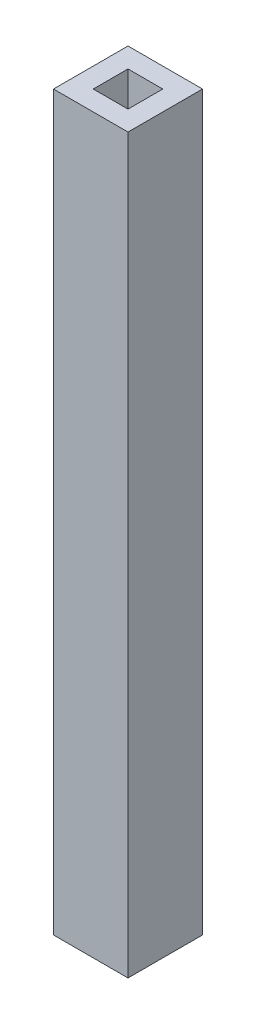
ISO-10303-21;
HEADER;
FILE_DESCRIPTION(('STEP AP214'),'2;1');
FILE_NAME('part.step','',(''),(''),'','','');
FILE_SCHEMA(('AUTOMOTIVE_DESIGN { 1 0 10303 214 1 1 1 1 }'));
ENDSEC;
DATA;
#1=APPLICATION_CONTEXT('core data for automotive mechanical design processes');
#2=APPLICATION_PROTOCOL_DEFINITION('international standard','automotive_design',2000,#1);
#3=PRODUCT_CONTEXT('',#1,'mechanical');
#4=PRODUCT('Part','Part','',(#3));
#5=PRODUCT_RELATED_PRODUCT_CATEGORY('part','',(#4));
#6=PRODUCT_DEFINITION_FORMATION('','',#4);
#7=PRODUCT_DEFINITION_CONTEXT('part definition',#1,'design');
#8=PRODUCT_DEFINITION('design','',#6,#7);
#9=PRODUCT_DEFINITION_SHAPE('','',#8);
#10=(LENGTH_UNIT() NAMED_UNIT(*) SI_UNIT(.MILLI.,.METRE.));
#11=(NAMED_UNIT(*) PLANE_ANGLE_UNIT() SI_UNIT($,.RADIAN.));
#12=(NAMED_UNIT(*) SI_UNIT($,.STERADIAN.) SOLID_ANGLE_UNIT());
#13=UNCERTAINTY_MEASURE_WITH_UNIT(LENGTH_MEASURE(1.E-05),#10,'distance_accuracy_value','');
#14=(GEOMETRIC_REPRESENTATION_CONTEXT(3) GLOBAL_UNCERTAINTY_ASSIGNED_CONTEXT((#13)) GLOBAL_UNIT_ASSIGNED_CONTEXT((#10,
#11,#12)) REPRESENTATION_CONTEXT('',''));
#15=CARTESIAN_POINT('',(0.,0.,0.));
#16=DIRECTION('',(0.,0.,1.));
#17=DIRECTION('',(1.,0.,0.));
#18=AXIS2_PLACEMENT_3D('',#15,#16,#17);
#19=CARTESIAN_POINT('',(0.,187.325,0.));
#20=DIRECTION('',(0.,1.,0.));
#21=DIRECTION('',(0.,0.,1.));
#22=AXIS2_PLACEMENT_3D('',#19,#20,#21);
#23=PLANE('',#22);
#24=DIRECTION('',(0.,0.,1.));
#25=VECTOR('',#24,1.);
#26=CARTESIAN_POINT('',(-63.3931078486445,187.325,106.247904755443));
#27=LINE('',#26,#25);
#28=CARTESIAN_POINT('',(-63.3931078486445,187.325,106.247904755443));
#29=VERTEX_POINT('',#28);
#30=CARTESIAN_POINT('',(-63.3931078486445,187.325,125.297904755443));
#31=VERTEX_POINT('',#30);
#32=EDGE_CURVE('E134',#29,#31,#27,.T.);
#33=ORIENTED_EDGE('',*,*,#32,.T.);
#34=DIRECTION('',(1.,0.,0.));
#35=VECTOR('',#34,1.);
#36=CARTESIAN_POINT('',(-63.3931078486445,187.325,125.297904755443));
#37=LINE('',#36,#35);
#38=CARTESIAN_POINT('',(-44.3431078486445,187.325,125.297904755443));
#39=VERTEX_POINT('',#38);
#40=EDGE_CURVE('E137',#31,#39,#37,.T.);
#41=ORIENTED_EDGE('',*,*,#40,.T.);
#42=DIRECTION('',(0.,0.,-1.));
#43=VECTOR('',#42,1.);
#44=CARTESIAN_POINT('',(-44.3431078486445,187.325,106.247904755443));
#45=LINE('',#44,#43);
#46=CARTESIAN_POINT('',(-44.3431078486445,187.325,106.247904755443));
#47=VERTEX_POINT('',#46);
#48=EDGE_CURVE('E140',#39,#47,#45,.T.);
#49=ORIENTED_EDGE('',*,*,#48,.T.);
#50=DIRECTION('',(-1.,0.,0.));
#51=VECTOR('',#50,1.);
#52=CARTESIAN_POINT('',(-63.3931078486445,187.325,106.247904755443));
#53=LINE('',#52,#51);
#54=EDGE_CURVE('E142',#47,#29,#53,.T.);
#55=ORIENTED_EDGE('',*,*,#54,.T.);
#56=EDGE_LOOP('',(#33,#41,#49,#55));
#57=FACE_BOUND('',#56,.T.);
#58=DIRECTION('',(1.,0.,0.));
#59=VECTOR('',#58,1.);
#60=CARTESIAN_POINT('',(-58.3131078486445,187.325,120.217904755443));
#61=LINE('',#60,#59);
#62=CARTESIAN_POINT('',(-58.3131078486445,187.325,120.217904755443));
#63=VERTEX_POINT('',#62);
#64=CARTESIAN_POINT('',(-49.4231078486445,187.325,120.217904755443));
#65=VERTEX_POINT('',#64);
#66=EDGE_CURVE('E106',#63,#65,#61,.T.);
#67=ORIENTED_EDGE('',*,*,#66,.F.);
#68=DIRECTION('',(0.,0.,1.));
#69=VECTOR('',#68,1.);
#70=CARTESIAN_POINT('',(-58.3131078486445,187.325,111.327904755443));
#71=LINE('',#70,#69);
#72=CARTESIAN_POINT('',(-58.3131078486445,187.325,111.327904755443));
#73=VERTEX_POINT('',#72);
#74=EDGE_CURVE('E98',#73,#63,#71,.T.);
#75=ORIENTED_EDGE('',*,*,#74,.F.);
#76=DIRECTION('',(-1.,0.,0.));
#77=VECTOR('',#76,1.);
#78=CARTESIAN_POINT('',(-58.3131078486445,187.325,111.327904755443));
#79=LINE('',#78,#77);
#80=CARTESIAN_POINT('',(-49.4231078486445,187.325,111.327904755443));
#81=VERTEX_POINT('',#80);
#82=EDGE_CURVE('E120',#81,#73,#79,.T.);
#83=ORIENTED_EDGE('',*,*,#82,.F.);
#84=DIRECTION('',(0.,0.,-1.));
#85=VECTOR('',#84,1.);
#86=CARTESIAN_POINT('',(-49.4231078486445,187.325,111.327904755443));
#87=LINE('',#86,#85);
#88=EDGE_CURVE('E118',#65,#81,#87,.T.);
#89=ORIENTED_EDGE('',*,*,#88,.F.);
#90=EDGE_LOOP('',(#67,#75,#83,#89));
#91=FACE_BOUND('',#90,.T.);
#92=ADVANCED_FACE('F33',(#57,#91),#23,.T.);
#93=CARTESIAN_POINT('',(0.,0.,0.));
#94=DIRECTION('',(0.,1.,0.));
#95=DIRECTION('',(0.,0.,1.));
#96=AXIS2_PLACEMENT_3D('',#93,#94,#95);
#97=PLANE('',#96);
#98=DIRECTION('',(0.,0.,1.));
#99=VECTOR('',#98,1.);
#100=CARTESIAN_POINT('',(-63.3931078486445,0.,106.247904755443));
#101=LINE('',#100,#99);
#102=CARTESIAN_POINT('',(-63.3931078486445,0.,106.247904755443));
#103=VERTEX_POINT('',#102);
#104=CARTESIAN_POINT('',(-63.3931078486445,0.,125.297904755443));
#105=VERTEX_POINT('',#104);
#106=EDGE_CURVE('E114',#103,#105,#101,.T.);
#107=ORIENTED_EDGE('',*,*,#106,.F.);
#108=DIRECTION('',(-1.,0.,0.));
#109=VECTOR('',#108,1.);
#110=CARTESIAN_POINT('',(-63.3931078486445,0.,106.247904755443));
#111=LINE('',#110,#109);
#112=CARTESIAN_POINT('',(-44.3431078486445,0.,106.247904755443));
#113=VERTEX_POINT('',#112);
#114=EDGE_CURVE('E138',#113,#103,#111,.T.);
#115=ORIENTED_EDGE('',*,*,#114,.F.);
#116=DIRECTION('',(0.,0.,-1.));
#117=VECTOR('',#116,1.);
#118=CARTESIAN_POINT('',(-44.3431078486445,0.,106.247904755443));
#119=LINE('',#118,#117);
#120=CARTESIAN_POINT('',(-44.3431078486445,0.,125.297904755443));
#121=VERTEX_POINT('',#120);
#122=EDGE_CURVE('E149',#121,#113,#119,.T.);
#123=ORIENTED_EDGE('',*,*,#122,.F.);
#124=DIRECTION('',(1.,0.,0.));
#125=VECTOR('',#124,1.);
#126=CARTESIAN_POINT('',(-63.3931078486445,0.,125.297904755443));
#127=LINE('',#126,#125);
#128=EDGE_CURVE('E147',#105,#121,#127,.T.);
#129=ORIENTED_EDGE('',*,*,#128,.F.);
#130=EDGE_LOOP('',(#107,#115,#123,#129));
#131=FACE_BOUND('',#130,.T.);
#132=DIRECTION('',(0.,0.,1.));
#133=VECTOR('',#132,1.);
#134=CARTESIAN_POINT('',(-58.3131078486445,0.,111.327904755443));
#135=LINE('',#134,#133);
#136=CARTESIAN_POINT('',(-58.3131078486445,0.,111.327904755443));
#137=VERTEX_POINT('',#136);
#138=CARTESIAN_POINT('',(-58.3131078486445,0.,120.217904755443));
#139=VERTEX_POINT('',#138);
#140=EDGE_CURVE('E56',#137,#139,#135,.T.);
#141=ORIENTED_EDGE('',*,*,#140,.T.);
#142=DIRECTION('',(1.,0.,0.));
#143=VECTOR('',#142,1.);
#144=CARTESIAN_POINT('',(-58.3131078486445,0.,120.217904755443));
#145=LINE('',#144,#143);
#146=CARTESIAN_POINT('',(-49.4231078486445,0.,120.217904755443));
#147=VERTEX_POINT('',#146);
#148=EDGE_CURVE('E113',#139,#147,#145,.T.);
#149=ORIENTED_EDGE('',*,*,#148,.T.);
#150=DIRECTION('',(0.,0.,-1.));
#151=VECTOR('',#150,1.);
#152=CARTESIAN_POINT('',(-49.4231078486445,0.,111.327904755443));
#153=LINE('',#152,#151);
#154=CARTESIAN_POINT('',(-49.4231078486445,0.,111.327904755443));
#155=VERTEX_POINT('',#154);
#156=EDGE_CURVE('E126',#147,#155,#153,.T.);
#157=ORIENTED_EDGE('',*,*,#156,.T.);
#158=DIRECTION('',(-1.,0.,0.));
#159=VECTOR('',#158,1.);
#160=CARTESIAN_POINT('',(-58.3131078486445,0.,111.327904755443));
#161=LINE('',#160,#159);
#162=EDGE_CURVE('E107',#155,#137,#161,.T.);
#163=ORIENTED_EDGE('',*,*,#162,.T.);
#164=EDGE_LOOP('',(#141,#149,#157,#163));
#165=FACE_BOUND('',#164,.T.);
#166=ADVANCED_FACE('F167',(#131,#165),#97,.F.);
#167=CARTESIAN_POINT('',(-63.3931078486445,187.325,106.247904755443));
#168=DIRECTION('',(1.,0.,0.));
#169=DIRECTION('',(0.,0.,-1.));
#170=AXIS2_PLACEMENT_3D('',#167,#168,#169);
#171=PLANE('',#170);
#172=ORIENTED_EDGE('',*,*,#106,.T.);
#173=DIRECTION('',(0.,-1.,0.));
#174=VECTOR('',#173,1.);
#175=CARTESIAN_POINT('',(-63.3931078486445,187.325,125.297904755443));
#176=LINE('',#175,#174);
#177=EDGE_CURVE('E11',#31,#105,#176,.T.);
#178=ORIENTED_EDGE('',*,*,#177,.F.);
#179=ORIENTED_EDGE('',*,*,#32,.F.);
#180=DIRECTION('',(0.,-1.,0.));
#181=VECTOR('',#180,1.);
#182=CARTESIAN_POINT('',(-63.3931078486445,187.325,106.247904755443));
#183=LINE('',#182,#181);
#184=EDGE_CURVE('E144',#29,#103,#183,.T.);
#185=ORIENTED_EDGE('',*,*,#184,.T.);
#186=EDGE_LOOP('',(#172,#178,#179,#185));
#187=FACE_BOUND('',#186,.T.);
#188=ADVANCED_FACE('F35',(#187),#171,.F.);
#189=CARTESIAN_POINT('',(-63.3931078486445,187.325,125.297904755443));
#190=DIRECTION('',(0.,0.,-1.));
#191=DIRECTION('',(-1.,0.,0.));
#192=AXIS2_PLACEMENT_3D('',#189,#190,#191);
#193=PLANE('',#192);
#194=ORIENTED_EDGE('',*,*,#128,.T.);
#195=DIRECTION('',(0.,-1.,0.));
#196=VECTOR('',#195,1.);
#197=CARTESIAN_POINT('',(-44.3431078486445,187.325,125.297904755443));
#198=LINE('',#197,#196);
#199=EDGE_CURVE('E41',#39,#121,#198,.T.);
#200=ORIENTED_EDGE('',*,*,#199,.F.);
#201=ORIENTED_EDGE('',*,*,#40,.F.);
#202=ORIENTED_EDGE('',*,*,#177,.T.);
#203=EDGE_LOOP('',(#194,#200,#201,#202));
#204=FACE_BOUND('',#203,.T.);
#205=ADVANCED_FACE('F177',(#204),#193,.F.);
#206=CARTESIAN_POINT('',(-44.3431078486445,187.325,106.247904755443));
#207=DIRECTION('',(-1.,0.,0.));
#208=DIRECTION('',(0.,0.,1.));
#209=AXIS2_PLACEMENT_3D('',#206,#207,#208);
#210=PLANE('',#209);
#211=ORIENTED_EDGE('',*,*,#122,.T.);
#212=DIRECTION('',(0.,-1.,0.));
#213=VECTOR('',#212,1.);
#214=CARTESIAN_POINT('',(-44.3431078486445,187.325,106.247904755443));
#215=LINE('',#214,#213);
#216=EDGE_CURVE('E154',#47,#113,#215,.T.);
#217=ORIENTED_EDGE('',*,*,#216,.F.);
#218=ORIENTED_EDGE('',*,*,#48,.F.);
#219=ORIENTED_EDGE('',*,*,#199,.T.);
#220=EDGE_LOOP('',(#211,#217,#218,#219));
#221=FACE_BOUND('',#220,.T.);
#222=ADVANCED_FACE('F161',(#221),#210,.F.);
#223=CARTESIAN_POINT('',(-63.3931078486445,187.325,106.247904755443));
#224=DIRECTION('',(0.,0.,1.));
#225=DIRECTION('',(1.,0.,0.));
#226=AXIS2_PLACEMENT_3D('',#223,#224,#225);
#227=PLANE('',#226);
#228=ORIENTED_EDGE('',*,*,#114,.T.);
#229=ORIENTED_EDGE('',*,*,#184,.F.);
#230=ORIENTED_EDGE('',*,*,#54,.F.);
#231=ORIENTED_EDGE('',*,*,#216,.T.);
#232=EDGE_LOOP('',(#228,#229,#230,#231));
#233=FACE_BOUND('',#232,.T.);
#234=ADVANCED_FACE('F171',(#233),#227,.F.);
#235=CARTESIAN_POINT('',(-58.3131078486445,187.325,111.327904755443));
#236=DIRECTION('',(1.,0.,0.));
#237=DIRECTION('',(0.,0.,-1.));
#238=AXIS2_PLACEMENT_3D('',#235,#236,#237);
#239=PLANE('',#238);
#240=ORIENTED_EDGE('',*,*,#140,.F.);
#241=DIRECTION('',(0.,-1.,0.));
#242=VECTOR('',#241,1.);
#243=CARTESIAN_POINT('',(-58.3131078486445,187.325,111.327904755443));
#244=LINE('',#243,#242);
#245=EDGE_CURVE('E102',#73,#137,#244,.T.);
#246=ORIENTED_EDGE('',*,*,#245,.F.);
#247=ORIENTED_EDGE('',*,*,#74,.T.);
#248=DIRECTION('',(0.,-1.,0.));
#249=VECTOR('',#248,1.);
#250=CARTESIAN_POINT('',(-58.3131078486445,187.325,120.217904755443));
#251=LINE('',#250,#249);
#252=EDGE_CURVE('E101',#63,#139,#251,.T.);
#253=ORIENTED_EDGE('',*,*,#252,.T.);
#254=EDGE_LOOP('',(#240,#246,#247,#253));
#255=FACE_BOUND('',#254,.T.);
#256=ADVANCED_FACE('F100',(#255),#239,.T.);
#257=CARTESIAN_POINT('',(-58.3131078486445,187.325,120.217904755443));
#258=DIRECTION('',(0.,0.,-1.));
#259=DIRECTION('',(-1.,0.,0.));
#260=AXIS2_PLACEMENT_3D('',#257,#258,#259);
#261=PLANE('',#260);
#262=ORIENTED_EDGE('',*,*,#148,.F.);
#263=ORIENTED_EDGE('',*,*,#252,.F.);
#264=ORIENTED_EDGE('',*,*,#66,.T.);
#265=DIRECTION('',(0.,-1.,0.));
#266=VECTOR('',#265,1.);
#267=CARTESIAN_POINT('',(-49.4231078486445,187.325,120.217904755443));
#268=LINE('',#267,#266);
#269=EDGE_CURVE('E115',#65,#147,#268,.T.);
#270=ORIENTED_EDGE('',*,*,#269,.T.);
#271=EDGE_LOOP('',(#262,#263,#264,#270));
#272=FACE_BOUND('',#271,.T.);
#273=ADVANCED_FACE('F110',(#272),#261,.T.);
#274=CARTESIAN_POINT('',(-49.4231078486445,187.325,111.327904755443));
#275=DIRECTION('',(-1.,0.,0.));
#276=DIRECTION('',(0.,0.,1.));
#277=AXIS2_PLACEMENT_3D('',#274,#275,#276);
#278=PLANE('',#277);
#279=ORIENTED_EDGE('',*,*,#156,.F.);
#280=ORIENTED_EDGE('',*,*,#269,.F.);
#281=ORIENTED_EDGE('',*,*,#88,.T.);
#282=DIRECTION('',(0.,-1.,0.));
#283=VECTOR('',#282,1.);
#284=CARTESIAN_POINT('',(-49.4231078486445,187.325,111.327904755443));
#285=LINE('',#284,#283);
#286=EDGE_CURVE('E48',#81,#155,#285,.T.);
#287=ORIENTED_EDGE('',*,*,#286,.T.);
#288=EDGE_LOOP('',(#279,#280,#281,#287));
#289=FACE_BOUND('',#288,.T.);
#290=ADVANCED_FACE('F200',(#289),#278,.T.);
#291=CARTESIAN_POINT('',(-58.3131078486445,187.325,111.327904755443));
#292=DIRECTION('',(0.,0.,1.));
#293=DIRECTION('',(1.,0.,0.));
#294=AXIS2_PLACEMENT_3D('',#291,#292,#293);
#295=PLANE('',#294);
#296=ORIENTED_EDGE('',*,*,#162,.F.);
#297=ORIENTED_EDGE('',*,*,#286,.F.);
#298=ORIENTED_EDGE('',*,*,#82,.T.);
#299=ORIENTED_EDGE('',*,*,#245,.T.);
#300=EDGE_LOOP('',(#296,#297,#298,#299));
#301=FACE_BOUND('',#300,.T.);
#302=ADVANCED_FACE('F204',(#301),#295,.T.);
#303=CLOSED_SHELL('',(#92,#166,#188,#205,#222,#234,#256,#273,#290,#302));
#304=MANIFOLD_SOLID_BREP('B2',#303);
#305=ADVANCED_BREP_SHAPE_REPRESENTATION('',(#18,#304),#14);
#306=SHAPE_DEFINITION_REPRESENTATION(#9,#305);
ENDSEC;
END-ISO-10303-21;
